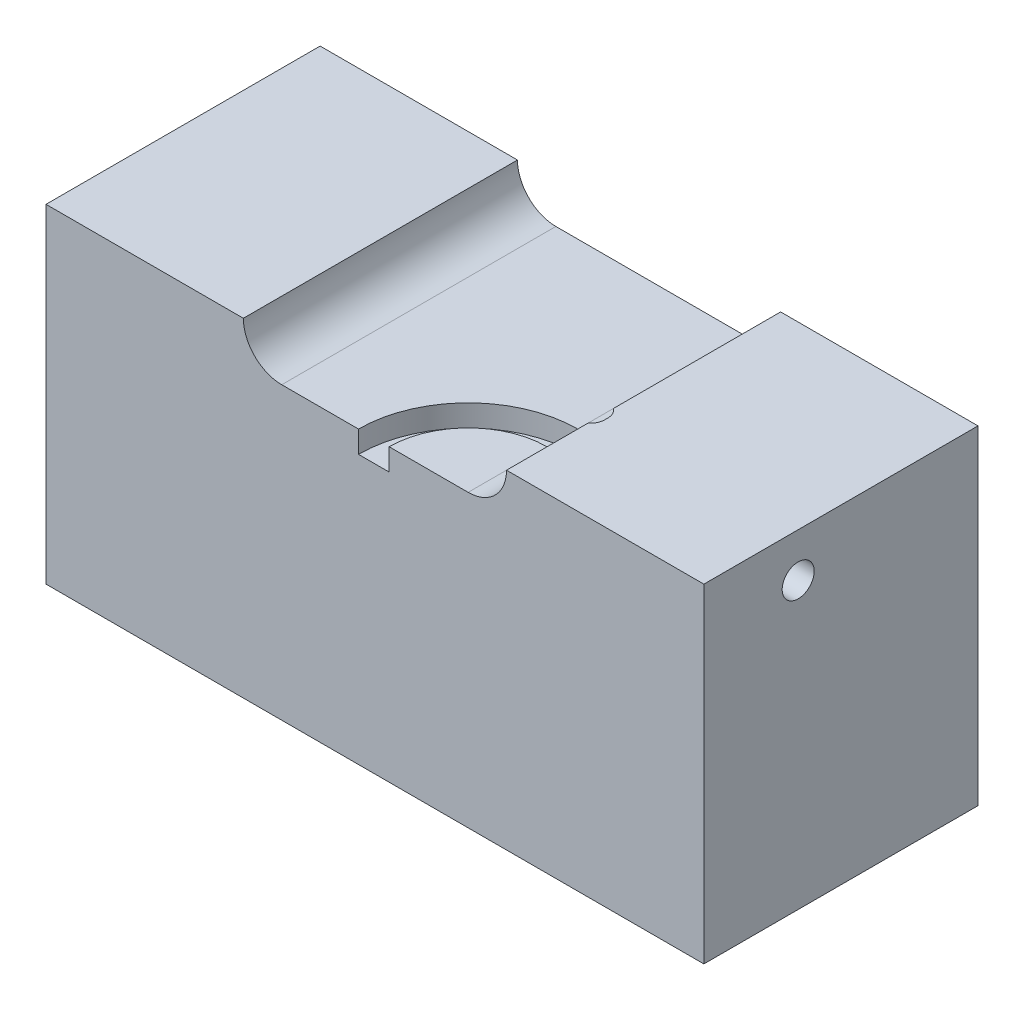
ISO-10303-21;
HEADER;
FILE_DESCRIPTION(('STEP AP214'),'2;1');
FILE_NAME('part.step','',(''),(''),'','','');
FILE_SCHEMA(('AUTOMOTIVE_DESIGN { 1 0 10303 214 1 1 1 1 }'));
ENDSEC;
DATA;
#1=APPLICATION_CONTEXT('core data for automotive mechanical design processes');
#2=APPLICATION_PROTOCOL_DEFINITION('international standard','automotive_design',2000,#1);
#3=PRODUCT_CONTEXT('',#1,'mechanical');
#4=PRODUCT('Part','Part','',(#3));
#5=PRODUCT_RELATED_PRODUCT_CATEGORY('part','',(#4));
#6=PRODUCT_DEFINITION_FORMATION('','',#4);
#7=PRODUCT_DEFINITION_CONTEXT('part definition',#1,'design');
#8=PRODUCT_DEFINITION('design','',#6,#7);
#9=PRODUCT_DEFINITION_SHAPE('','',#8);
#10=(LENGTH_UNIT() NAMED_UNIT(*) SI_UNIT(.MILLI.,.METRE.));
#11=(NAMED_UNIT(*) PLANE_ANGLE_UNIT() SI_UNIT($,.RADIAN.));
#12=(NAMED_UNIT(*) SI_UNIT($,.STERADIAN.) SOLID_ANGLE_UNIT());
#13=UNCERTAINTY_MEASURE_WITH_UNIT(LENGTH_MEASURE(1.E-05),#10,'distance_accuracy_value','');
#14=(GEOMETRIC_REPRESENTATION_CONTEXT(3) GLOBAL_UNCERTAINTY_ASSIGNED_CONTEXT((#13)) GLOBAL_UNIT_ASSIGNED_CONTEXT((#10,
#11,#12)) REPRESENTATION_CONTEXT('',''));
#15=CARTESIAN_POINT('',(0.,0.,0.));
#16=DIRECTION('',(0.,0.,1.));
#17=DIRECTION('',(1.,0.,0.));
#18=AXIS2_PLACEMENT_3D('',#15,#16,#17);
#19=CARTESIAN_POINT('',(7.14375000000001,15.5575,2.57175));
#20=DIRECTION('',(0.,1.,0.));
#21=DIRECTION('',(-1.,0.,0.));
#22=AXIS2_PLACEMENT_3D('',#19,#20,#21);
#23=CYLINDRICAL_SURFACE('',#22,0.79375);
#24=DIRECTION('',(0.,1.,0.));
#25=VECTOR('',#24,1.);
#26=CARTESIAN_POINT('',(7.93750000000001,15.5575,2.57174999999999));
#27=LINE('',#26,#25);
#28=CARTESIAN_POINT('',(7.93750000000001,17.432194040048,2.57174999999999));
#29=VERTEX_POINT('',#28);
#30=CARTESIAN_POINT('',(7.93750000000001,19.05,2.57174999999999));
#31=VERTEX_POINT('',#30);
#32=EDGE_CURVE('E267',#29,#31,#27,.T.);
#33=ORIENTED_EDGE('',*,*,#32,.F.);
#34=CARTESIAN_POINT('',(7.93750000000001,17.432194040048,2.57174999999999));
#35=CARTESIAN_POINT('',(7.93750241256333,17.4301936525798,2.59114478348494));
#36=CARTESIAN_POINT('',(7.93678870871886,17.4275767551003,2.6104621743929));
#37=CARTESIAN_POINT('',(7.93398641219167,17.4211587801819,2.64877953405351));
#38=CARTESIAN_POINT('',(7.93189915885153,17.4173588582055,2.66777979355258));
#39=CARTESIAN_POINT('',(7.92371352293546,17.4043339271178,2.72375715508424));
#40=CARTESIAN_POINT('',(7.91568889593078,17.3934433707352,2.76008855282001));
#41=CARTESIAN_POINT('',(7.895237760106,17.3679176659708,2.82987248338225));
#42=CARTESIAN_POINT('',(7.88282703010999,17.3532959918654,2.8633348082929));
#43=CARTESIAN_POINT('',(7.85435108605227,17.3209943364583,2.9271502135495));
#44=CARTESIAN_POINT('',(7.83827706911014,17.3033070133269,2.95749554469169));
#45=CARTESIAN_POINT('',(7.7950458041358,17.2568268517615,3.02812150391445));
#46=CARTESIAN_POINT('',(7.76620526596445,17.2266872046281,3.06648526942747));
#47=CARTESIAN_POINT('',(7.70386176114061,17.1631883580013,3.13611411534587));
#48=CARTESIAN_POINT('',(7.67034850885852,17.1298221071251,3.16736312385349));
#49=CARTESIAN_POINT('',(7.59865541927083,17.0604677895308,3.22385803437785));
#50=CARTESIAN_POINT('',(7.56037261542773,17.0244328617208,3.24891527401671));
#51=CARTESIAN_POINT('',(7.50013032175958,16.9706006600362,3.28136164838984));
#52=CARTESIAN_POINT('',(7.47959277776844,16.9527037493227,3.29131618012628));
#53=CARTESIAN_POINT('',(7.43740812370543,16.9173727822183,3.30953925463318));
#54=CARTESIAN_POINT('',(7.41576180347949,16.899938409412,3.31780897725127));
#55=CARTESIAN_POINT('',(7.37545059999082,16.8695567149893,3.33116497950011));
#56=CARTESIAN_POINT('',(7.35704266951007,16.856403873353,3.33655739616009));
#57=CARTESIAN_POINT('',(7.31896103433903,16.8315037640402,3.34617004709823));
#58=CARTESIAN_POINT('',(7.29928734644973,16.819756477713,3.35039029693117));
#59=CARTESIAN_POINT('',(7.26442510912182,16.8021227309386,3.35640819331776));
#60=CARTESIAN_POINT('',(7.24966003728041,16.7955350172339,3.35855282231827));
#61=CARTESIAN_POINT('',(7.21928974650045,16.784519893377,3.36204332277608));
#62=CARTESIAN_POINT('',(7.2036895553853,16.7800808834197,3.36339349186303));
#63=CARTESIAN_POINT('',(7.18055609109639,16.7758076177804,3.36467942917183));
#64=CARTESIAN_POINT('',(7.17325894960945,16.7747822406778,3.36498501857166));
#65=CARTESIAN_POINT('',(7.15856018619977,16.7733972488647,3.36539622095228));
#66=CARTESIAN_POINT('',(7.15115822518164,16.7730409698786,3.36550083203409));
#67=CARTESIAN_POINT('',(7.14375,16.7730464027505,3.3655));
#68=B_SPLINE_CURVE_WITH_KNOTS('',3,(#34,#35,#36,#37,#38,#39,#40,#41,#42,#43,#44,#45,#46,#47,#48,
#49,#50,#51,#52,#53,#54,#55,#56,#57,#58,#59,#60,#61,#62,#63,#64,#65,#66,#67),.UNSPECIFIED.,.F.,
.F.,(4,2,2,2,2,2,2,2,2,2,2,2,2,2,2,2,4),(0.,0.0584453265147501,0.1168337475043,
0.232488737897985,0.347731829907221,0.463254826944108,0.632339979221343,0.801803378714477,
0.975925812136693,1.06288483108186,1.14978274295621,1.21949579483512,1.28920792157083,
1.33802178064912,1.38656909412918,1.40866379827517,1.43086836401875),.UNSPECIFIED.);
#69=CARTESIAN_POINT('',(7.14375,16.7730464027505,3.3655));
#70=VERTEX_POINT('',#69);
#71=EDGE_CURVE('E48',#29,#70,#68,.T.);
#72=ORIENTED_EDGE('',*,*,#71,.T.);
#73=DIRECTION('',(0.,1.,0.));
#74=VECTOR('',#73,1.);
#75=CARTESIAN_POINT('',(7.14375,15.5575,3.3655));
#76=LINE('',#75,#74);
#77=CARTESIAN_POINT('',(7.14375,17.6751846714922,3.3655));
#78=VERTEX_POINT('',#77);
#79=EDGE_CURVE('E262',#70,#78,#76,.T.);
#80=ORIENTED_EDGE('',*,*,#79,.T.);
#81=CARTESIAN_POINT('',(7.62000000000001,19.05,3.20675));
#82=CARTESIAN_POINT('',(7.62000808222505,18.9976620086764,3.20669678540611));
#83=CARTESIAN_POINT('',(7.61815174304965,18.9453473715379,3.20813629686458));
#84=CARTESIAN_POINT('',(7.61078125391763,18.8411829924741,3.21358908145641));
#85=CARTESIAN_POINT('',(7.60527233116839,18.7893326933517,3.21759867627471));
#86=CARTESIAN_POINT('',(7.59066211493761,18.6863268479517,3.22778576557001));
#87=CARTESIAN_POINT('',(7.58155825030525,18.6351718260926,3.23396481131604));
#88=CARTESIAN_POINT('',(7.5598465844707,18.5338125931217,3.24781870998652));
#89=CARTESIAN_POINT('',(7.5472375453096,18.4836087246421,3.25549409110067));
#90=CARTESIAN_POINT('',(7.50289921844771,18.3299016765049,3.28043820747756));
#91=CARTESIAN_POINT('',(7.46535418005992,18.2282472369929,3.2990066799425));
#92=CARTESIAN_POINT('',(7.37568261057651,18.0312061917664,3.33236202096677));
#93=CARTESIAN_POINT('',(7.32360883953245,17.9357984212855,3.34716220863326));
#94=CARTESIAN_POINT('',(7.2458227786617,17.8153311257624,3.3591368661238));
#95=CARTESIAN_POINT('',(7.22636452973084,17.7866863514485,3.36144747485569));
#96=CARTESIAN_POINT('',(7.18607326983955,17.7302594935604,3.36462852535922));
#97=CARTESIAN_POINT('',(7.16523897881772,17.7024782496364,3.36549760595795));
#98=CARTESIAN_POINT('',(7.14375,17.6751846714922,3.3655));
#99=B_SPLINE_CURVE_WITH_KNOTS('',3,(#81,#82,#83,#84,#85,#86,#87,#88,#89,#90,#91,#92,#93,#94,#95,
#96,#97,#98),.UNSPECIFIED.,.F.,.F.,(4,2,2,2,2,2,2,2,4),(0.,0.156923704265635,0.313623318561804,
0.470435210112985,0.627302555066313,0.955983364493304,1.28348578985539,1.3875449931461,
1.49170239923897),.UNSPECIFIED.);
#100=CARTESIAN_POINT('',(7.62000000000001,19.05,3.20675));
#101=VERTEX_POINT('',#100);
#102=EDGE_CURVE('E450',#101,#78,#99,.T.);
#103=ORIENTED_EDGE('',*,*,#102,.F.);
#104=CARTESIAN_POINT('',(7.14375000000001,19.05,2.57175));
#105=DIRECTION('',(0.,1.,0.));
#106=DIRECTION('',(1.,0.,0.));
#107=AXIS2_PLACEMENT_3D('',#104,#105,#106);
#108=CIRCLE('',#107,0.79375);
#109=EDGE_CURVE('E269',#101,#31,#108,.T.);
#110=ORIENTED_EDGE('',*,*,#109,.T.);
#111=EDGE_LOOP('',(#33,#72,#80,#103,#110));
#112=FACE_BOUND('',#111,.T.);
#113=ADVANCED_FACE('F33',(#112),#23,.F.);
#114=CARTESIAN_POINT('',(7.14375000000001,15.5575,2.38125));
#115=DIRECTION('',(0.,1.,0.));
#116=DIRECTION('',(-1.,0.,0.));
#117=AXIS2_PLACEMENT_3D('',#114,#115,#116);
#118=CYLINDRICAL_SURFACE('',#117,0.79375);
#119=DIRECTION('',(0.,1.,0.));
#120=VECTOR('',#119,1.);
#121=CARTESIAN_POINT('',(7.14375,15.5575,1.5875));
#122=LINE('',#121,#120);
#123=CARTESIAN_POINT('',(7.14375,16.7730464027505,1.5875));
#124=VERTEX_POINT('',#123);
#125=CARTESIAN_POINT('',(7.14375,17.6751846714922,1.5875));
#126=VERTEX_POINT('',#125);
#127=EDGE_CURVE('E413',#124,#126,#122,.T.);
#128=ORIENTED_EDGE('',*,*,#127,.F.);
#129=CARTESIAN_POINT('',(7.14375,16.7730464027505,1.5875));
#130=CARTESIAN_POINT('',(7.15893791785662,16.7729781622669,1.58748921704763));
#131=CARTESIAN_POINT('',(7.17400569118337,16.774520458918,1.58793488840093));
#132=CARTESIAN_POINT('',(7.2033431203434,16.7800966910772,1.58960967974904));
#133=CARTESIAN_POINT('',(7.2176225803887,16.7840818079715,1.59082346437744));
#134=CARTESIAN_POINT('',(7.25380469471549,16.79680827117,1.59484356499905));
#135=CARTESIAN_POINT('',(7.27512209176527,16.8069686475094,1.59816869743157));
#136=CARTESIAN_POINT('',(7.31633968048021,16.8297623078841,1.60620308347879));
#137=CARTESIAN_POINT('',(7.33621959877839,16.8424240312471,1.61092860089324));
#138=CARTESIAN_POINT('',(7.3778704294022,16.8711125710446,1.62245813516733));
#139=CARTESIAN_POINT('',(7.39943301006975,16.8873533586215,1.62947398619911));
#140=CARTESIAN_POINT('',(7.44138305141542,16.920593693588,1.64507521373498));
#141=CARTESIAN_POINT('',(7.46176933083153,16.9375939742988,1.65366213305371));
#142=CARTESIAN_POINT('',(7.5214319364034,16.9889203174978,1.68172805605678));
#143=CARTESIAN_POINT('',(7.55930056775818,17.0236393239732,1.70353759601027));
#144=CARTESIAN_POINT('',(7.63841851328629,17.098430775985,1.75829927874638));
#145=CARTESIAN_POINT('',(7.67896795887995,17.1382846809269,1.79257458129802));
#146=CARTESIAN_POINT('',(7.75403094099641,17.2140168410449,1.87084007747242));
#147=CARTESIAN_POINT('',(7.78855810799545,17.2499040050053,1.91480780899977));
#148=CARTESIAN_POINT('',(7.83769152755564,17.302647647905,1.994244816951));
#149=CARTESIAN_POINT('',(7.85491185054322,17.3215928274382,2.02671440914579));
#150=CARTESIAN_POINT('',(7.88511096397851,17.3559280219605,2.0952126040897));
#151=CARTESIAN_POINT('',(7.89810333803431,17.371329374934,2.13122931488013));
#152=CARTESIAN_POINT('',(7.91781786866114,17.3962994434745,2.2021977765273));
#153=CARTESIAN_POINT('',(7.92506881061527,17.4063207127409,2.2368382969144));
#154=CARTESIAN_POINT('',(7.93245517265907,17.418352232104,2.29009390820122));
#155=CARTESIAN_POINT('',(7.93433608261143,17.4218715687023,2.30814513676567));
#156=CARTESIAN_POINT('',(7.93686009185863,17.4278440916586,2.3445246385013));
#157=CARTESIAN_POINT('',(7.93750208529729,17.4302963240094,2.36285314447942));
#158=CARTESIAN_POINT('',(7.93750000000001,17.432194040048,2.38125));
#159=B_SPLINE_CURVE_WITH_KNOTS('',3,(#129,#130,#131,#132,#133,#134,#135,#136,#137,#138,#139,
#140,#141,#142,#143,#144,#145,#146,#147,#148,#149,#150,#151,#152,#153,#154,#155,#156,#157,#158),
.UNSPECIFIED.,.F.,.F.,(4,2,2,2,2,2,2,2,2,2,2,2,2,2,4),(0.,0.0452895664750722,0.0897022840237409,
0.16084907513867,0.232856893385674,0.316417547963784,0.400060705247937,0.56700730952557,
0.765293828106022,0.963125562501087,1.08674096362214,1.20995519788227,1.31975004138661,
1.37514445888962,1.43058829859038),.UNSPECIFIED.);
#160=CARTESIAN_POINT('',(7.93750000000001,17.432194040048,2.38125));
#161=VERTEX_POINT('',#160);
#162=EDGE_CURVE('E194',#124,#161,#159,.T.);
#163=ORIENTED_EDGE('',*,*,#162,.T.);
#164=DIRECTION('',(0.,1.,0.));
#165=VECTOR('',#164,1.);
#166=CARTESIAN_POINT('',(7.93750000000001,15.5575,2.38125));
#167=LINE('',#166,#165);
#168=CARTESIAN_POINT('',(7.93750000000001,19.05,2.38125));
#169=VERTEX_POINT('',#168);
#170=EDGE_CURVE('E277',#161,#169,#167,.T.);
#171=ORIENTED_EDGE('',*,*,#170,.T.);
#172=CARTESIAN_POINT('',(7.14375000000001,19.05,2.38125));
#173=DIRECTION('',(0.,1.,0.));
#174=DIRECTION('',(-1.,0.,0.));
#175=AXIS2_PLACEMENT_3D('',#172,#173,#174);
#176=CIRCLE('',#175,0.79375);
#177=CARTESIAN_POINT('',(7.62000000000001,19.05,1.74625));
#178=VERTEX_POINT('',#177);
#179=EDGE_CURVE('E56',#169,#178,#176,.T.);
#180=ORIENTED_EDGE('',*,*,#179,.T.);
#181=CARTESIAN_POINT('',(7.14375,17.6751846714922,1.5875));
#182=CARTESIAN_POINT('',(7.17493882903404,17.7147904593139,1.58751596606703));
#183=CARTESIAN_POINT('',(7.20473558813774,17.7554189700609,1.58933610151038));
#184=CARTESIAN_POINT('',(7.26136996565832,17.8383868944045,1.59574312729626));
#185=CARTESIAN_POINT('',(7.28821258149453,17.8807232477425,1.60032525746599));
#186=CARTESIAN_POINT('',(7.3389098633342,17.966975133551,1.61142884391584));
#187=CARTESIAN_POINT('',(7.36275997006245,18.0108929475555,1.61795320951428));
#188=CARTESIAN_POINT('',(7.40738778736858,18.1000808312739,1.63219518026388));
#189=CARTESIAN_POINT('',(7.4281640525646,18.1453515251891,1.63991334329549));
#190=CARTESIAN_POINT('',(7.48841301880205,18.2891746871459,1.66485679832621));
#191=CARTESIAN_POINT('',(7.52239504808017,18.3899758849743,1.68294497040577));
#192=CARTESIAN_POINT('',(7.56234987491672,18.54428448952,1.70667488917068));
#193=CARTESIAN_POINT('',(7.57382524483121,18.5961801786834,1.71401164819873));
#194=CARTESIAN_POINT('',(7.59305267803054,18.7008824439455,1.7268035479083));
#195=CARTESIAN_POINT('',(7.6008067955423,18.7536885007802,1.73225972624879));
#196=CARTESIAN_POINT('',(7.61108668898027,18.8470681393693,1.73963762139058));
#197=CARTESIAN_POINT('',(7.6144233283184,18.8875119988091,1.74209497073602));
#198=CARTESIAN_POINT('',(7.61888265518496,18.9686335235272,1.74541197906694));
#199=CARTESIAN_POINT('',(7.62000273710662,19.009311407665,1.74626975765739));
#200=CARTESIAN_POINT('',(7.62000000000001,19.05,1.74625));
#201=B_SPLINE_CURVE_WITH_KNOTS('',3,(#181,#182,#183,#184,#185,#186,#187,#188,#189,#190,#191,
#192,#193,#194,#195,#196,#197,#198,#199,#200),.UNSPECIFIED.,.F.,.F.,(4,2,2,2,2,2,2,2,2,4),(0.,
0.151091968467232,0.301924278346454,0.452983670059177,0.604113868697295,0.926493060198701,
1.08733203777102,1.24808212567329,1.36996150858661,1.49198407820246),.UNSPECIFIED.);
#202=EDGE_CURVE('E351',#126,#178,#201,.T.);
#203=ORIENTED_EDGE('',*,*,#202,.F.);
#204=EDGE_LOOP('',(#128,#163,#171,#180,#203));
#205=FACE_BOUND('',#204,.T.);
#206=ADVANCED_FACE('F368',(#205),#118,.F.);
#207=CARTESIAN_POINT('',(7.93750000000001,15.5575,2.57174999999999));
#208=DIRECTION('',(1.,0.,0.));
#209=DIRECTION('',(0.,1.,0.));
#210=AXIS2_PLACEMENT_3D('',#207,#208,#209);
#211=PLANE('',#210);
#212=CARTESIAN_POINT('',(7.93750000000001,15.5575,2.57174999999999));
#213=VERTEX_POINT('',#212);
#214=CARTESIAN_POINT('',(7.93750000000001,15.587805959952,2.57174999999999));
#215=VERTEX_POINT('',#214);
#216=EDGE_CURVE('E273',#213,#215,#27,.T.);
#217=ORIENTED_EDGE('',*,*,#216,.T.);
#218=CARTESIAN_POINT('',(7.93750000000001,16.51,2.4765));
#219=DIRECTION('',(1.,0.,0.));
#220=DIRECTION('',(0.,1.,0.));
#221=AXIS2_PLACEMENT_3D('',#218,#219,#220);
#222=CIRCLE('',#221,0.9271);
#223=CARTESIAN_POINT('',(7.93750000000001,15.587805959952,2.38125));
#224=VERTEX_POINT('',#223);
#225=EDGE_CURVE('E41',#215,#224,#222,.T.);
#226=ORIENTED_EDGE('',*,*,#225,.T.);
#227=CARTESIAN_POINT('',(7.93750000000001,15.5575,2.38125));
#228=VERTEX_POINT('',#227);
#229=EDGE_CURVE('E283',#228,#224,#167,.T.);
#230=ORIENTED_EDGE('',*,*,#229,.F.);
#231=DIRECTION('',(0.,0.,-1.));
#232=VECTOR('',#231,1.);
#233=CARTESIAN_POINT('',(7.93750000000001,15.5575,2.57174999999999));
#234=LINE('',#233,#232);
#235=EDGE_CURVE('E421',#213,#228,#234,.T.);
#236=ORIENTED_EDGE('',*,*,#235,.F.);
#237=EDGE_LOOP('',(#217,#226,#230,#236));
#238=FACE_BOUND('',#237,.T.);
#239=ADVANCED_FACE('F373',(#238),#211,.F.);
#240=CARTESIAN_POINT('',(-5.3975,16.8275,17.4625));
#241=DIRECTION('',(0.,-1.,0.));
#242=DIRECTION('',(1.,0.,0.));
#243=AXIS2_PLACEMENT_3D('',#240,#241,#242);
#244=PLANE('',#243);
#245=DIRECTION('',(0.,0.,-1.));
#246=VECTOR('',#245,1.);
#247=CARTESIAN_POINT('',(5.3975,16.8275,17.4625));
#248=LINE('',#247,#246);
#249=CARTESIAN_POINT('',(5.3975,16.8275,7.9375));
#250=VERTEX_POINT('',#249);
#251=CARTESIAN_POINT('',(5.39750000000001,16.8275,3.3655));
#252=VERTEX_POINT('',#251);
#253=EDGE_CURVE('E298',#250,#252,#248,.T.);
#254=ORIENTED_EDGE('',*,*,#253,.T.);
#255=CARTESIAN_POINT('',(5.3975,16.8275,7.9375));
#256=DIRECTION('',(0.,-1.,0.));
#257=DIRECTION('',(1.,0.,0.));
#258=AXIS2_PLACEMENT_3D('',#255,#256,#257);
#259=CIRCLE('',#258,4.572);
#260=CARTESIAN_POINT('',(0.825500000000005,16.8275,7.9375));
#261=VERTEX_POINT('',#260);
#262=EDGE_CURVE('E453',#252,#261,#259,.F.);
#263=ORIENTED_EDGE('',*,*,#262,.T.);
#264=DIRECTION('',(-1.,0.,0.));
#265=VECTOR('',#264,1.);
#266=CARTESIAN_POINT('',(-19.05,16.8275,7.9375));
#267=LINE('',#266,#265);
#268=EDGE_CURVE('E348',#250,#261,#267,.T.);
#269=ORIENTED_EDGE('',*,*,#268,.F.);
#270=EDGE_LOOP('',(#254,#263,#269));
#271=FACE_BOUND('',#270,.T.);
#272=ADVANCED_FACE('F380',(#271),#244,.F.);
#273=CARTESIAN_POINT('',(5.3975,19.05,17.4625));
#274=DIRECTION('',(0.,0.,-1.));
#275=DIRECTION('',(-1.,0.,0.));
#276=AXIS2_PLACEMENT_3D('',#273,#274,#275);
#277=CYLINDRICAL_SURFACE('',#276,2.2225);
#278=DIRECTION('',(0.,0.,-1.));
#279=VECTOR('',#278,1.);
#280=CARTESIAN_POINT('',(7.62000000000001,19.05,17.4625));
#281=LINE('',#280,#279);
#282=CARTESIAN_POINT('',(7.62,19.05,7.9375));
#283=VERTEX_POINT('',#282);
#284=EDGE_CURVE('E340',#101,#283,#281,.F.);
#285=ORIENTED_EDGE('',*,*,#284,.F.);
#286=ORIENTED_EDGE('',*,*,#102,.T.);
#287=CARTESIAN_POINT('',(5.3975,19.05,3.3655));
#288=DIRECTION('',(0.,0.,1.));
#289=DIRECTION('',(1.,0.,0.));
#290=AXIS2_PLACEMENT_3D('',#287,#288,#289);
#291=CIRCLE('',#290,2.2225);
#292=EDGE_CURVE('E443',#78,#252,#291,.F.);
#293=ORIENTED_EDGE('',*,*,#292,.T.);
#294=ORIENTED_EDGE('',*,*,#253,.F.);
#295=CARTESIAN_POINT('',(5.3975,19.05,7.9375));
#296=DIRECTION('',(0.,0.,-1.));
#297=DIRECTION('',(-1.,0.,0.));
#298=AXIS2_PLACEMENT_3D('',#295,#296,#297);
#299=CIRCLE('',#298,2.2225);
#300=EDGE_CURVE('E297',#283,#250,#299,.T.);
#301=ORIENTED_EDGE('',*,*,#300,.F.);
#302=EDGE_LOOP('',(#285,#286,#293,#294,#301));
#303=FACE_BOUND('',#302,.T.);
#304=ADVANCED_FACE('F448',(#303),#277,.F.);
#305=CARTESIAN_POINT('',(0.,19.05,0.));
#306=DIRECTION('',(0.,-1.,0.));
#307=DIRECTION('',(0.,0.,-1.));
#308=AXIS2_PLACEMENT_3D('',#305,#306,#307);
#309=PLANE('',#308);
#310=DIRECTION('',(1.,0.,0.));
#311=VECTOR('',#310,1.);
#312=CARTESIAN_POINT('',(-19.05,19.05,7.9375));
#313=LINE('',#312,#311);
#314=CARTESIAN_POINT('',(-19.05,19.05,7.9375));
#315=VERTEX_POINT('',#314);
#316=CARTESIAN_POINT('',(-7.61999999999999,19.05,7.9375));
#317=VERTEX_POINT('',#316);
#318=EDGE_CURVE('E318',#315,#317,#313,.T.);
#319=ORIENTED_EDGE('',*,*,#318,.T.);
#320=DIRECTION('',(0.,0.,-1.));
#321=VECTOR('',#320,1.);
#322=CARTESIAN_POINT('',(-7.61999999999999,19.05,17.4625));
#323=LINE('',#322,#321);
#324=CARTESIAN_POINT('',(-7.61999999999999,19.05,-7.9375));
#325=VERTEX_POINT('',#324);
#326=EDGE_CURVE('E344',#317,#325,#323,.T.);
#327=ORIENTED_EDGE('',*,*,#326,.T.);
#328=DIRECTION('',(-1.,0.,0.));
#329=VECTOR('',#328,1.);
#330=CARTESIAN_POINT('',(-19.05,19.05,-7.9375));
#331=LINE('',#330,#329);
#332=CARTESIAN_POINT('',(-19.05,19.05,-7.9375));
#333=VERTEX_POINT('',#332);
#334=EDGE_CURVE('E310',#325,#333,#331,.T.);
#335=ORIENTED_EDGE('',*,*,#334,.T.);
#336=DIRECTION('',(0.,0.,1.));
#337=VECTOR('',#336,1.);
#338=CARTESIAN_POINT('',(-19.05,19.05,7.9375));
#339=LINE('',#338,#337);
#340=EDGE_CURVE('E315',#333,#315,#339,.T.);
#341=ORIENTED_EDGE('',*,*,#340,.T.);
#342=EDGE_LOOP('',(#319,#327,#335,#341));
#343=FACE_BOUND('',#342,.T.);
#344=ADVANCED_FACE('F465',(#343),#309,.F.);
#345=CARTESIAN_POINT('',(19.05,19.05,7.9375));
#346=DIRECTION('',(-1.,0.,0.));
#347=DIRECTION('',(0.,0.,1.));
#348=AXIS2_PLACEMENT_3D('',#345,#346,#347);
#349=PLANE('',#348);
#350=CARTESIAN_POINT('',(19.05,16.51,2.4765));
#351=DIRECTION('',(1.,0.,0.));
#352=DIRECTION('',(0.,0.,-1.));
#353=AXIS2_PLACEMENT_3D('',#350,#351,#352);
#354=CIRCLE('',#353,0.9271);
#355=CARTESIAN_POINT('',(19.05,16.51,1.5494));
#356=VERTEX_POINT('',#355);
#357=EDGE_CURVE('E202',#356,#356,#354,.T.);
#358=ORIENTED_EDGE('',*,*,#357,.F.);
#359=EDGE_LOOP('',(#358));
#360=FACE_BOUND('',#359,.T.);
#361=DIRECTION('',(0.,0.,-1.));
#362=VECTOR('',#361,1.);
#363=CARTESIAN_POINT('',(19.05,0.,7.9375));
#364=LINE('',#363,#362);
#365=CARTESIAN_POINT('',(19.05,0.,7.9375));
#366=VERTEX_POINT('',#365);
#367=CARTESIAN_POINT('',(19.05,0.,-7.9375));
#368=VERTEX_POINT('',#367);
#369=EDGE_CURVE('E306',#366,#368,#364,.T.);
#370=ORIENTED_EDGE('',*,*,#369,.T.);
#371=DIRECTION('',(0.,-1.,0.));
#372=VECTOR('',#371,1.);
#373=CARTESIAN_POINT('',(19.05,19.05,-7.9375));
#374=LINE('',#373,#372);
#375=CARTESIAN_POINT('',(19.05,19.05,-7.9375));
#376=VERTEX_POINT('',#375);
#377=EDGE_CURVE('E337',#376,#368,#374,.T.);
#378=ORIENTED_EDGE('',*,*,#377,.F.);
#379=DIRECTION('',(0.,0.,-1.));
#380=VECTOR('',#379,1.);
#381=CARTESIAN_POINT('',(19.05,19.05,7.9375));
#382=LINE('',#381,#380);
#383=CARTESIAN_POINT('',(19.05,19.05,7.9375));
#384=VERTEX_POINT('',#383);
#385=EDGE_CURVE('E307',#384,#376,#382,.T.);
#386=ORIENTED_EDGE('',*,*,#385,.F.);
#387=DIRECTION('',(0.,-1.,0.));
#388=VECTOR('',#387,1.);
#389=CARTESIAN_POINT('',(19.05,19.05,7.9375));
#390=LINE('',#389,#388);
#391=EDGE_CURVE('E321',#384,#366,#390,.T.);
#392=ORIENTED_EDGE('',*,*,#391,.T.);
#393=EDGE_LOOP('',(#370,#378,#386,#392));
#394=FACE_BOUND('',#393,.T.);
#395=ADVANCED_FACE('F35',(#360,#394),#349,.F.);
#396=CARTESIAN_POINT('',(-19.05,19.05,-7.9375));
#397=DIRECTION('',(0.,0.,1.));
#398=DIRECTION('',(1.,0.,0.));
#399=AXIS2_PLACEMENT_3D('',#396,#397,#398);
#400=PLANE('',#399);
#401=ORIENTED_EDGE('',*,*,#334,.F.);
#402=CARTESIAN_POINT('',(-5.39749999999999,19.05,-7.9375));
#403=DIRECTION('',(0.,0.,-1.));
#404=DIRECTION('',(-1.,0.,0.));
#405=AXIS2_PLACEMENT_3D('',#402,#403,#404);
#406=CIRCLE('',#405,2.2225);
#407=CARTESIAN_POINT('',(-5.3975,16.8275,-7.9375));
#408=VERTEX_POINT('',#407);
#409=EDGE_CURVE('E285',#408,#325,#406,.T.);
#410=ORIENTED_EDGE('',*,*,#409,.F.);
#411=DIRECTION('',(-1.,0.,0.));
#412=VECTOR('',#411,1.);
#413=CARTESIAN_POINT('',(-5.3975,16.8275,-7.9375));
#414=LINE('',#413,#412);
#415=CARTESIAN_POINT('',(5.3975,16.8275,-7.9375));
#416=VERTEX_POINT('',#415);
#417=EDGE_CURVE('E291',#416,#408,#414,.T.);
#418=ORIENTED_EDGE('',*,*,#417,.F.);
#419=CARTESIAN_POINT('',(5.3975,19.05,-7.9375));
#420=DIRECTION('',(0.,0.,-1.));
#421=DIRECTION('',(-1.,0.,0.));
#422=AXIS2_PLACEMENT_3D('',#419,#420,#421);
#423=CIRCLE('',#422,2.2225);
#424=CARTESIAN_POINT('',(7.62000000000001,19.05,-7.9375));
#425=VERTEX_POINT('',#424);
#426=EDGE_CURVE('E287',#425,#416,#423,.T.);
#427=ORIENTED_EDGE('',*,*,#426,.F.);
#428=EDGE_CURVE('E312',#376,#425,#331,.T.);
#429=ORIENTED_EDGE('',*,*,#428,.F.);
#430=ORIENTED_EDGE('',*,*,#377,.T.);
#431=DIRECTION('',(-1.,0.,0.));
#432=VECTOR('',#431,1.);
#433=CARTESIAN_POINT('',(-19.05,0.,-7.9375));
#434=LINE('',#433,#432);
#435=CARTESIAN_POINT('',(-19.05,0.,-7.9375));
#436=VERTEX_POINT('',#435);
#437=EDGE_CURVE('E324',#368,#436,#434,.T.);
#438=ORIENTED_EDGE('',*,*,#437,.T.);
#439=DIRECTION('',(0.,-1.,0.));
#440=VECTOR('',#439,1.);
#441=CARTESIAN_POINT('',(-19.05,19.05,-7.9375));
#442=LINE('',#441,#440);
#443=EDGE_CURVE('E334',#333,#436,#442,.T.);
#444=ORIENTED_EDGE('',*,*,#443,.F.);
#445=EDGE_LOOP('',(#401,#410,#418,#427,#429,#430,#438,#444));
#446=FACE_BOUND('',#445,.T.);
#447=ADVANCED_FACE('F464',(#446),#400,.F.);
#448=CARTESIAN_POINT('',(-19.05,19.05,7.9375));
#449=DIRECTION('',(1.,0.,0.));
#450=DIRECTION('',(0.,0.,-1.));
#451=AXIS2_PLACEMENT_3D('',#448,#449,#450);
#452=PLANE('',#451);
#453=DIRECTION('',(0.,0.,1.));
#454=VECTOR('',#453,1.);
#455=CARTESIAN_POINT('',(-19.05,0.,7.9375));
#456=LINE('',#455,#454);
#457=CARTESIAN_POINT('',(-19.05,0.,7.9375));
#458=VERTEX_POINT('',#457);
#459=EDGE_CURVE('E326',#436,#458,#456,.T.);
#460=ORIENTED_EDGE('',*,*,#459,.T.);
#461=DIRECTION('',(0.,-1.,0.));
#462=VECTOR('',#461,1.);
#463=CARTESIAN_POINT('',(-19.05,19.05,7.9375));
#464=LINE('',#463,#462);
#465=EDGE_CURVE('E331',#315,#458,#464,.T.);
#466=ORIENTED_EDGE('',*,*,#465,.F.);
#467=ORIENTED_EDGE('',*,*,#340,.F.);
#468=ORIENTED_EDGE('',*,*,#443,.T.);
#469=EDGE_LOOP('',(#460,#466,#467,#468));
#470=FACE_BOUND('',#469,.T.);
#471=ADVANCED_FACE('F506',(#470),#452,.F.);
#472=CARTESIAN_POINT('',(-19.05,19.05,7.9375));
#473=DIRECTION('',(0.,0.,-1.));
#474=DIRECTION('',(-1.,0.,0.));
#475=AXIS2_PLACEMENT_3D('',#472,#473,#474);
#476=PLANE('',#475);
#477=ORIENTED_EDGE('',*,*,#268,.T.);
#478=DIRECTION('',(0.,1.,0.));
#479=VECTOR('',#478,1.);
#480=CARTESIAN_POINT('',(0.825500000000005,15.5575,7.9375));
#481=LINE('',#480,#479);
#482=CARTESIAN_POINT('',(0.825500000000005,15.5575,7.9375));
#483=VERTEX_POINT('',#482);
#484=EDGE_CURVE('E406',#483,#261,#481,.T.);
#485=ORIENTED_EDGE('',*,*,#484,.F.);
#486=DIRECTION('',(1.,0.,0.));
#487=VECTOR('',#486,1.);
#488=CARTESIAN_POINT('',(0.825500000000005,15.5575,7.9375));
#489=LINE('',#488,#487);
#490=CARTESIAN_POINT('',(-0.952499999999995,15.5575,7.9375));
#491=VERTEX_POINT('',#490);
#492=EDGE_CURVE('E436',#491,#483,#489,.T.);
#493=ORIENTED_EDGE('',*,*,#492,.F.);
#494=DIRECTION('',(0.,1.,0.));
#495=VECTOR('',#494,1.);
#496=CARTESIAN_POINT('',(-0.952499999999995,15.5575,7.9375));
#497=LINE('',#496,#495);
#498=CARTESIAN_POINT('',(-0.952499999999995,16.8275,7.9375));
#499=VERTEX_POINT('',#498);
#500=EDGE_CURVE('E408',#491,#499,#497,.T.);
#501=ORIENTED_EDGE('',*,*,#500,.T.);
#502=CARTESIAN_POINT('',(-5.3975,16.8275,7.9375));
#503=VERTEX_POINT('',#502);
#504=EDGE_CURVE('E347',#499,#503,#267,.T.);
#505=ORIENTED_EDGE('',*,*,#504,.T.);
#506=CARTESIAN_POINT('',(-5.39749999999999,19.05,7.9375));
#507=DIRECTION('',(0.,0.,-1.));
#508=DIRECTION('',(-1.,0.,0.));
#509=AXIS2_PLACEMENT_3D('',#506,#507,#508);
#510=CIRCLE('',#509,2.2225);
#511=EDGE_CURVE('E303',#503,#317,#510,.T.);
#512=ORIENTED_EDGE('',*,*,#511,.T.);
#513=ORIENTED_EDGE('',*,*,#318,.F.);
#514=ORIENTED_EDGE('',*,*,#465,.T.);
#515=DIRECTION('',(1.,0.,0.));
#516=VECTOR('',#515,1.);
#517=CARTESIAN_POINT('',(-19.05,0.,7.9375));
#518=LINE('',#517,#516);
#519=EDGE_CURVE('E311',#458,#366,#518,.T.);
#520=ORIENTED_EDGE('',*,*,#519,.T.);
#521=ORIENTED_EDGE('',*,*,#391,.F.);
#522=EDGE_CURVE('E317',#283,#384,#313,.T.);
#523=ORIENTED_EDGE('',*,*,#522,.F.);
#524=ORIENTED_EDGE('',*,*,#300,.T.);
#525=EDGE_LOOP('',(#477,#485,#493,#501,#505,#512,#513,#514,#520,#521,#523,#524));
#526=FACE_BOUND('',#525,.T.);
#527=ADVANCED_FACE('F455',(#526),#476,.F.);
#528=DIRECTION('',(0.,0.,-1.));
#529=VECTOR('',#528,1.);
#530=CARTESIAN_POINT('',(7.93750000000001,19.05,2.57174999999999));
#531=LINE('',#530,#529);
#532=EDGE_CURVE('E416',#31,#169,#531,.T.);
#533=ORIENTED_EDGE('',*,*,#532,.F.);
#534=ORIENTED_EDGE('',*,*,#109,.F.);
#535=ORIENTED_EDGE('',*,*,#284,.T.);
#536=ORIENTED_EDGE('',*,*,#522,.T.);
#537=ORIENTED_EDGE('',*,*,#385,.T.);
#538=ORIENTED_EDGE('',*,*,#428,.T.);
#539=EDGE_CURVE('E341',#425,#178,#281,.F.);
#540=ORIENTED_EDGE('',*,*,#539,.T.);
#541=ORIENTED_EDGE('',*,*,#179,.F.);
#542=EDGE_LOOP('',(#533,#534,#535,#536,#537,#538,#540,#541));
#543=FACE_BOUND('',#542,.T.);
#544=ADVANCED_FACE('F419',(#543),#309,.F.);
#545=CARTESIAN_POINT('',(0.,0.,0.));
#546=DIRECTION('',(0.,-1.,0.));
#547=DIRECTION('',(0.,0.,-1.));
#548=AXIS2_PLACEMENT_3D('',#545,#546,#547);
#549=PLANE('',#548);
#550=ORIENTED_EDGE('',*,*,#369,.F.);
#551=ORIENTED_EDGE('',*,*,#519,.F.);
#552=ORIENTED_EDGE('',*,*,#459,.F.);
#553=ORIENTED_EDGE('',*,*,#437,.F.);
#554=EDGE_LOOP('',(#550,#551,#552,#553));
#555=FACE_BOUND('',#554,.T.);
#556=ADVANCED_FACE('F471',(#555),#549,.T.);
#557=ORIENTED_EDGE('',*,*,#504,.F.);
#558=CARTESIAN_POINT('',(5.3975,16.8275,7.9375));
#559=DIRECTION('',(0.,-1.,0.));
#560=DIRECTION('',(1.,0.,0.));
#561=AXIS2_PLACEMENT_3D('',#558,#559,#560);
#562=CIRCLE('',#561,6.35);
#563=CARTESIAN_POINT('',(5.3975,16.8275,1.5875));
#564=VERTEX_POINT('',#563);
#565=EDGE_CURVE('E484',#499,#564,#562,.T.);
#566=ORIENTED_EDGE('',*,*,#565,.T.);
#567=EDGE_CURVE('E294',#564,#416,#248,.T.);
#568=ORIENTED_EDGE('',*,*,#567,.T.);
#569=ORIENTED_EDGE('',*,*,#417,.T.);
#570=DIRECTION('',(0.,0.,-1.));
#571=VECTOR('',#570,1.);
#572=CARTESIAN_POINT('',(-5.3975,16.8275,17.4625));
#573=LINE('',#572,#571);
#574=EDGE_CURVE('E295',#503,#408,#573,.T.);
#575=ORIENTED_EDGE('',*,*,#574,.F.);
#576=EDGE_LOOP('',(#557,#566,#568,#569,#575));
#577=FACE_BOUND('',#576,.T.);
#578=ADVANCED_FACE('F487',(#577),#244,.F.);
#579=CARTESIAN_POINT('',(-5.39749999999999,19.05,17.4625));
#580=DIRECTION('',(0.,0.,-1.));
#581=DIRECTION('',(-1.,0.,0.));
#582=AXIS2_PLACEMENT_3D('',#579,#580,#581);
#583=CYLINDRICAL_SURFACE('',#582,2.2225);
#584=ORIENTED_EDGE('',*,*,#574,.T.);
#585=ORIENTED_EDGE('',*,*,#409,.T.);
#586=ORIENTED_EDGE('',*,*,#326,.F.);
#587=ORIENTED_EDGE('',*,*,#511,.F.);
#588=EDGE_LOOP('',(#584,#585,#586,#587));
#589=FACE_BOUND('',#588,.T.);
#590=ADVANCED_FACE('F501',(#589),#583,.F.);
#591=ORIENTED_EDGE('',*,*,#567,.F.);
#592=CARTESIAN_POINT('',(5.3975,19.05,1.5875));
#593=DIRECTION('',(0.,0.,-1.));
#594=DIRECTION('',(-1.,0.,0.));
#595=AXIS2_PLACEMENT_3D('',#592,#593,#594);
#596=CIRCLE('',#595,2.2225);
#597=EDGE_CURVE('E357',#564,#126,#596,.F.);
#598=ORIENTED_EDGE('',*,*,#597,.T.);
#599=ORIENTED_EDGE('',*,*,#202,.T.);
#600=ORIENTED_EDGE('',*,*,#539,.F.);
#601=ORIENTED_EDGE('',*,*,#426,.T.);
#602=EDGE_LOOP('',(#591,#598,#599,#600,#601));
#603=FACE_BOUND('',#602,.T.);
#604=ADVANCED_FACE('F359',(#603),#277,.F.);
#605=CARTESIAN_POINT('',(5.3975,15.5575,7.9375));
#606=DIRECTION('',(0.,1.,0.));
#607=DIRECTION('',(-1.,0.,0.));
#608=AXIS2_PLACEMENT_3D('',#605,#606,#607);
#609=CYLINDRICAL_SURFACE('',#608,4.572);
#610=DIRECTION('',(0.,1.,0.));
#611=VECTOR('',#610,1.);
#612=CARTESIAN_POINT('',(5.39750000000001,15.5575,3.3655));
#613=LINE('',#612,#611);
#614=CARTESIAN_POINT('',(5.39750000000001,15.5575,3.3655));
#615=VERTEX_POINT('',#614);
#616=EDGE_CURVE('E401',#615,#252,#613,.T.);
#617=ORIENTED_EDGE('',*,*,#616,.F.);
#618=CARTESIAN_POINT('',(5.3975,15.5575,7.9375));
#619=DIRECTION('',(0.,-1.,0.));
#620=DIRECTION('',(-1.,0.,0.));
#621=AXIS2_PLACEMENT_3D('',#618,#619,#620);
#622=CIRCLE('',#621,4.572);
#623=EDGE_CURVE('E279',#483,#615,#622,.T.);
#624=ORIENTED_EDGE('',*,*,#623,.F.);
#625=ORIENTED_EDGE('',*,*,#484,.T.);
#626=ORIENTED_EDGE('',*,*,#262,.F.);
#627=EDGE_LOOP('',(#617,#624,#625,#626));
#628=FACE_BOUND('',#627,.T.);
#629=ADVANCED_FACE('F393',(#628),#609,.T.);
#630=CARTESIAN_POINT('',(5.3975,15.5575,7.9375));
#631=DIRECTION('',(0.,1.,0.));
#632=DIRECTION('',(-1.,0.,0.));
#633=AXIS2_PLACEMENT_3D('',#630,#631,#632);
#634=CYLINDRICAL_SURFACE('',#633,6.35);
#635=ORIENTED_EDGE('',*,*,#500,.F.);
#636=CARTESIAN_POINT('',(5.3975,15.5575,7.9375));
#637=DIRECTION('',(0.,1.,0.));
#638=DIRECTION('',(-1.,0.,0.));
#639=AXIS2_PLACEMENT_3D('',#636,#637,#638);
#640=CIRCLE('',#639,6.35);
#641=CARTESIAN_POINT('',(5.3975,15.5575,1.5875));
#642=VERTEX_POINT('',#641);
#643=EDGE_CURVE('E433',#642,#491,#640,.T.);
#644=ORIENTED_EDGE('',*,*,#643,.F.);
#645=DIRECTION('',(0.,1.,0.));
#646=VECTOR('',#645,1.);
#647=CARTESIAN_POINT('',(5.3975,15.5575,1.5875));
#648=LINE('',#647,#646);
#649=EDGE_CURVE('E411',#642,#564,#648,.T.);
#650=ORIENTED_EDGE('',*,*,#649,.T.);
#651=ORIENTED_EDGE('',*,*,#565,.F.);
#652=EDGE_LOOP('',(#635,#644,#650,#651));
#653=FACE_BOUND('',#652,.T.);
#654=ADVANCED_FACE('F387',(#653),#634,.F.);
#655=CARTESIAN_POINT('',(7.14375,15.5575,3.3655));
#656=VERTEX_POINT('',#655);
#657=CARTESIAN_POINT('',(7.14375,16.2469535972495,3.3655));
#658=VERTEX_POINT('',#657);
#659=EDGE_CURVE('E288',#656,#658,#76,.T.);
#660=ORIENTED_EDGE('',*,*,#659,.T.);
#661=CARTESIAN_POINT('',(7.14375,16.2469535972495,3.3655));
#662=CARTESIAN_POINT('',(7.15893791785662,16.2470218377331,3.36551078295237));
#663=CARTESIAN_POINT('',(7.17400569118337,16.245479541082,3.36506511159906));
#664=CARTESIAN_POINT('',(7.2033431203434,16.2399033089228,3.36339032025096));
#665=CARTESIAN_POINT('',(7.2176225803887,16.2359181920285,3.36217653562256));
#666=CARTESIAN_POINT('',(7.25380469471549,16.22319172883,3.35815643500094));
#667=CARTESIAN_POINT('',(7.27512209176527,16.2130313524906,3.35483130256843));
#668=CARTESIAN_POINT('',(7.31633968048021,16.1902376921159,3.34679691652121));
#669=CARTESIAN_POINT('',(7.33621959877839,16.1775759687529,3.34207139910676));
#670=CARTESIAN_POINT('',(7.37787042940221,16.1488874289554,3.33054186483266));
#671=CARTESIAN_POINT('',(7.39943301006975,16.1326466413785,3.32352601380089));
#672=CARTESIAN_POINT('',(7.44138305141542,16.099406306412,3.30792478626502));
#673=CARTESIAN_POINT('',(7.46176933083153,16.0824060257012,3.29933786694629));
#674=CARTESIAN_POINT('',(7.52143193640341,16.0310796825022,3.27127194394322));
#675=CARTESIAN_POINT('',(7.55930056775819,15.9963606760268,3.24946240398973));
#676=CARTESIAN_POINT('',(7.63841851328629,15.921569224015,3.19470072125361));
#677=CARTESIAN_POINT('',(7.67896795887996,15.8817153190731,3.16042541870197));
#678=CARTESIAN_POINT('',(7.75403094099641,15.8059831589551,3.08215992252758));
#679=CARTESIAN_POINT('',(7.78855810799545,15.7700959949947,3.03819219100022));
#680=CARTESIAN_POINT('',(7.83769152755564,15.717352352095,2.95875518304899));
#681=CARTESIAN_POINT('',(7.85491185054322,15.6984071725618,2.92628559085421));
#682=CARTESIAN_POINT('',(7.88511096397851,15.6640719780395,2.8577873959103));
#683=CARTESIAN_POINT('',(7.89810333803431,15.648670625066,2.82177068511987));
#684=CARTESIAN_POINT('',(7.91781786866114,15.6237005565255,2.7508022234727));
#685=CARTESIAN_POINT('',(7.92506881061527,15.6136792872591,2.7161617030856));
#686=CARTESIAN_POINT('',(7.93245517265907,15.601647767896,2.66290609179878));
#687=CARTESIAN_POINT('',(7.93433608261143,15.5981284312977,2.64485486323432));
#688=CARTESIAN_POINT('',(7.93686009185863,15.5921559083414,2.6084753614987));
#689=CARTESIAN_POINT('',(7.93750208529729,15.5897036759906,2.59014685552058));
#690=CARTESIAN_POINT('',(7.93750000000001,15.587805959952,2.57174999999999));
#691=B_SPLINE_CURVE_WITH_KNOTS('',3,(#661,#662,#663,#664,#665,#666,#667,#668,#669,#670,#671,
#672,#673,#674,#675,#676,#677,#678,#679,#680,#681,#682,#683,#684,#685,#686,#687,#688,#689,#690),
.UNSPECIFIED.,.F.,.F.,(4,2,2,2,2,2,2,2,2,2,2,2,2,2,4),(0.,0.0452895664750714,0.0897022840237408,
0.16084907513867,0.232856893385673,0.316417547963784,0.400060705247942,0.567007309525573,
0.765293828106026,0.963125562501088,1.08674096362214,1.20995519788227,1.31975004138661,
1.37514445888961,1.43058829859037),.UNSPECIFIED.);
#692=EDGE_CURVE('E210',#658,#215,#691,.T.);
#693=ORIENTED_EDGE('',*,*,#692,.T.);
#694=ORIENTED_EDGE('',*,*,#216,.F.);
#695=CARTESIAN_POINT('',(7.14375000000001,15.5575,2.57175));
#696=DIRECTION('',(0.,1.,0.));
#697=DIRECTION('',(1.,0.,0.));
#698=AXIS2_PLACEMENT_3D('',#695,#696,#697);
#699=CIRCLE('',#698,0.79375);
#700=EDGE_CURVE('E398',#656,#213,#699,.T.);
#701=ORIENTED_EDGE('',*,*,#700,.F.);
#702=EDGE_LOOP('',(#660,#693,#694,#701));
#703=FACE_BOUND('',#702,.T.);
#704=ADVANCED_FACE('F230',(#703),#23,.F.);
#705=CARTESIAN_POINT('',(5.3975,15.5575,3.3655));
#706=DIRECTION('',(0.,0.,1.));
#707=DIRECTION('',(1.,0.,0.));
#708=AXIS2_PLACEMENT_3D('',#705,#706,#707);
#709=PLANE('',#708);
#710=DIRECTION('',(0.,1.,0.));
#711=VECTOR('',#710,1.);
#712=CARTESIAN_POINT('',(6.35000000000001,15.5575,3.3655));
#713=LINE('',#712,#711);
#714=CARTESIAN_POINT('',(6.35000000000001,16.2469535972495,3.3655));
#715=VERTEX_POINT('',#714);
#716=CARTESIAN_POINT('',(6.35000000000001,16.7730464027505,3.3655));
#717=VERTEX_POINT('',#716);
#718=EDGE_CURVE('E260',#715,#717,#713,.T.);
#719=ORIENTED_EDGE('',*,*,#718,.F.);
#720=DIRECTION('',(1.,0.,0.));
#721=VECTOR('',#720,1.);
#722=CARTESIAN_POINT('',(6.35000000000001,16.2469535972495,3.3655));
#723=LINE('',#722,#721);
#724=EDGE_CURVE('E214',#715,#658,#723,.T.);
#725=ORIENTED_EDGE('',*,*,#724,.T.);
#726=ORIENTED_EDGE('',*,*,#659,.F.);
#727=DIRECTION('',(1.,0.,0.));
#728=VECTOR('',#727,1.);
#729=CARTESIAN_POINT('',(5.3975,15.5575,3.3655));
#730=LINE('',#729,#728);
#731=EDGE_CURVE('E274',#615,#656,#730,.T.);
#732=ORIENTED_EDGE('',*,*,#731,.F.);
#733=ORIENTED_EDGE('',*,*,#616,.T.);
#734=ORIENTED_EDGE('',*,*,#292,.F.);
#735=ORIENTED_EDGE('',*,*,#79,.F.);
#736=DIRECTION('',(1.,0.,0.));
#737=VECTOR('',#736,1.);
#738=CARTESIAN_POINT('',(6.35000000000001,16.7730464027505,3.3655));
#739=LINE('',#738,#737);
#740=EDGE_CURVE('E216',#70,#717,#739,.F.);
#741=ORIENTED_EDGE('',*,*,#740,.T.);
#742=EDGE_LOOP('',(#719,#725,#726,#732,#733,#734,#735,#741));
#743=FACE_BOUND('',#742,.T.);
#744=ADVANCED_FACE('F258',(#743),#709,.F.);
#745=CARTESIAN_POINT('',(7.14375,15.5575,1.5875));
#746=DIRECTION('',(0.,0.,-1.));
#747=DIRECTION('',(-1.,0.,0.));
#748=AXIS2_PLACEMENT_3D('',#745,#746,#747);
#749=PLANE('',#748);
#750=DIRECTION('',(0.,-1.,0.));
#751=VECTOR('',#750,1.);
#752=CARTESIAN_POINT('',(6.35000000000001,15.5575,1.5875));
#753=LINE('',#752,#751);
#754=CARTESIAN_POINT('',(6.35000000000001,16.7730464027505,1.5875));
#755=VERTEX_POINT('',#754);
#756=CARTESIAN_POINT('',(6.35000000000001,16.2469535972495,1.5875));
#757=VERTEX_POINT('',#756);
#758=EDGE_CURVE('E11',#755,#757,#753,.T.);
#759=ORIENTED_EDGE('',*,*,#758,.F.);
#760=DIRECTION('',(1.,0.,0.));
#761=VECTOR('',#760,1.);
#762=CARTESIAN_POINT('',(6.35000000000001,16.7730464027505,1.5875));
#763=LINE('',#762,#761);
#764=EDGE_CURVE('E187',#755,#124,#763,.T.);
#765=ORIENTED_EDGE('',*,*,#764,.T.);
#766=ORIENTED_EDGE('',*,*,#127,.T.);
#767=ORIENTED_EDGE('',*,*,#597,.F.);
#768=ORIENTED_EDGE('',*,*,#649,.F.);
#769=DIRECTION('',(-1.,0.,0.));
#770=VECTOR('',#769,1.);
#771=CARTESIAN_POINT('',(7.14375,15.5575,1.5875));
#772=LINE('',#771,#770);
#773=CARTESIAN_POINT('',(7.14375,15.5575,1.5875));
#774=VERTEX_POINT('',#773);
#775=EDGE_CURVE('E430',#774,#642,#772,.T.);
#776=ORIENTED_EDGE('',*,*,#775,.F.);
#777=CARTESIAN_POINT('',(7.14375,16.2469535972495,1.5875));
#778=VERTEX_POINT('',#777);
#779=EDGE_CURVE('E208',#774,#778,#122,.T.);
#780=ORIENTED_EDGE('',*,*,#779,.T.);
#781=DIRECTION('',(1.,0.,0.));
#782=VECTOR('',#781,1.);
#783=CARTESIAN_POINT('',(6.35000000000001,16.2469535972495,1.5875));
#784=LINE('',#783,#782);
#785=EDGE_CURVE('E206',#778,#757,#784,.F.);
#786=ORIENTED_EDGE('',*,*,#785,.T.);
#787=EDGE_LOOP('',(#759,#765,#766,#767,#768,#776,#780,#786));
#788=FACE_BOUND('',#787,.T.);
#789=ADVANCED_FACE('F204',(#788),#749,.F.);
#790=ORIENTED_EDGE('',*,*,#229,.T.);
#791=CARTESIAN_POINT('',(7.93750000000001,15.587805959952,2.38125));
#792=CARTESIAN_POINT('',(7.93750241256333,15.5898063474202,2.36185521651505));
#793=CARTESIAN_POINT('',(7.93678870871886,15.5924232448997,2.3425378256071));
#794=CARTESIAN_POINT('',(7.93398641219167,15.5988412198181,2.30422046594649));
#795=CARTESIAN_POINT('',(7.93189915885153,15.6026411417945,2.28522020644742));
#796=CARTESIAN_POINT('',(7.92371352293546,15.6156660728822,2.22924284491576));
#797=CARTESIAN_POINT('',(7.91568889593078,15.6265566292648,2.19291144717999));
#798=CARTESIAN_POINT('',(7.895237760106,15.6520823340292,2.12312751661775));
#799=CARTESIAN_POINT('',(7.88282703010999,15.6667040081346,2.0896651917071));
#800=CARTESIAN_POINT('',(7.85435108605227,15.6990056635417,2.0258497864505));
#801=CARTESIAN_POINT('',(7.83827706911014,15.7166929866731,1.99550445530831));
#802=CARTESIAN_POINT('',(7.79504580413581,15.7631731482385,1.92487849608555));
#803=CARTESIAN_POINT('',(7.76620526596445,15.7933127953719,1.88651473057253));
#804=CARTESIAN_POINT('',(7.70386176114061,15.8568116419987,1.81688588465413));
#805=CARTESIAN_POINT('',(7.67034850885852,15.8901778928749,1.7856368761465));
#806=CARTESIAN_POINT('',(7.59865541927083,15.9595322104692,1.72914196562215));
#807=CARTESIAN_POINT('',(7.56037261542773,15.9955671382792,1.70408472598329));
#808=CARTESIAN_POINT('',(7.50013032175958,16.0493993399638,1.67163835161016));
#809=CARTESIAN_POINT('',(7.47959277776844,16.0672962506773,1.66168381987371));
#810=CARTESIAN_POINT('',(7.43740812370543,16.1026272177817,1.64346074536682));
#811=CARTESIAN_POINT('',(7.41576180347949,16.120061590588,1.63519102274873));
#812=CARTESIAN_POINT('',(7.37545059999083,16.1504432850107,1.62183502049988));
#813=CARTESIAN_POINT('',(7.35704266951007,16.163596126647,1.61644260383991));
#814=CARTESIAN_POINT('',(7.31896103433903,16.1884962359598,1.60682995290177));
#815=CARTESIAN_POINT('',(7.29928734644974,16.200243522287,1.60260970306883));
#816=CARTESIAN_POINT('',(7.26442510912182,16.2178772690614,1.59659180668224));
#817=CARTESIAN_POINT('',(7.24966003728041,16.2244649827661,1.59444717768172));
#818=CARTESIAN_POINT('',(7.21928974650045,16.235480106623,1.59095667722392));
#819=CARTESIAN_POINT('',(7.20368955538531,16.2399191165803,1.58960650813697));
#820=CARTESIAN_POINT('',(7.18055609109639,16.2441923822196,1.58832057082817));
#821=CARTESIAN_POINT('',(7.17325894960945,16.2452177593222,1.58801498142834));
#822=CARTESIAN_POINT('',(7.15856018619977,16.2466027511353,1.58760377904772));
#823=CARTESIAN_POINT('',(7.15115822518164,16.2469590301214,1.58749916796591));
#824=CARTESIAN_POINT('',(7.14375,16.2469535972495,1.5875));
#825=B_SPLINE_CURVE_WITH_KNOTS('',3,(#791,#792,#793,#794,#795,#796,#797,#798,#799,#800,#801,
#802,#803,#804,#805,#806,#807,#808,#809,#810,#811,#812,#813,#814,#815,#816,#817,#818,#819,#820,
#821,#822,#823,#824),.UNSPECIFIED.,.F.,.F.,(4,2,2,2,2,2,2,2,2,2,2,2,2,2,2,2,4),(0.,
0.0584453265147484,0.116833747504299,0.232488737897986,0.347731829907221,0.463254826944108,
0.632339979221338,0.801803378714477,0.975925812136693,1.06288483108185,1.14978274295621,
1.21949579483512,1.28920792157083,1.33802178064912,1.38656909412918,1.40866379827517,
1.43086836401875),.UNSPECIFIED.);
#826=EDGE_CURVE('E211',#224,#778,#825,.T.);
#827=ORIENTED_EDGE('',*,*,#826,.T.);
#828=ORIENTED_EDGE('',*,*,#779,.F.);
#829=CARTESIAN_POINT('',(7.14375000000001,15.5575,2.38125));
#830=DIRECTION('',(0.,1.,0.));
#831=DIRECTION('',(-1.,0.,0.));
#832=AXIS2_PLACEMENT_3D('',#829,#830,#831);
#833=CIRCLE('',#832,0.79375);
#834=EDGE_CURVE('E427',#228,#774,#833,.T.);
#835=ORIENTED_EDGE('',*,*,#834,.F.);
#836=EDGE_LOOP('',(#790,#827,#828,#835));
#837=FACE_BOUND('',#836,.T.);
#838=ADVANCED_FACE('F362',(#837),#118,.F.);
#839=ORIENTED_EDGE('',*,*,#170,.F.);
#840=EDGE_CURVE('E490',#161,#29,#222,.T.);
#841=ORIENTED_EDGE('',*,*,#840,.T.);
#842=ORIENTED_EDGE('',*,*,#32,.T.);
#843=ORIENTED_EDGE('',*,*,#532,.T.);
#844=EDGE_LOOP('',(#839,#841,#842,#843));
#845=FACE_BOUND('',#844,.T.);
#846=ADVANCED_FACE('F366',(#845),#211,.F.);
#847=CARTESIAN_POINT('',(7.14375000000001,15.5575,2.57175));
#848=DIRECTION('',(0.,-1.,0.));
#849=DIRECTION('',(1.,0.,0.));
#850=AXIS2_PLACEMENT_3D('',#847,#848,#849);
#851=PLANE('',#850);
#852=ORIENTED_EDGE('',*,*,#700,.T.);
#853=ORIENTED_EDGE('',*,*,#235,.T.);
#854=ORIENTED_EDGE('',*,*,#834,.T.);
#855=ORIENTED_EDGE('',*,*,#775,.T.);
#856=ORIENTED_EDGE('',*,*,#643,.T.);
#857=ORIENTED_EDGE('',*,*,#492,.T.);
#858=ORIENTED_EDGE('',*,*,#623,.T.);
#859=ORIENTED_EDGE('',*,*,#731,.T.);
#860=EDGE_LOOP('',(#852,#853,#854,#855,#856,#857,#858,#859));
#861=FACE_BOUND('',#860,.T.);
#862=ADVANCED_FACE('F240',(#861),#851,.F.);
#863=CARTESIAN_POINT('',(6.35000000000001,16.51,2.4765));
#864=DIRECTION('',(1.,0.,0.));
#865=DIRECTION('',(0.,0.,-1.));
#866=AXIS2_PLACEMENT_3D('',#863,#864,#865);
#867=PLANE('',#866);
#868=ORIENTED_EDGE('',*,*,#718,.T.);
#869=CARTESIAN_POINT('',(6.35000000000001,16.51,2.4765));
#870=DIRECTION('',(1.,0.,0.));
#871=DIRECTION('',(0.,0.,-1.));
#872=AXIS2_PLACEMENT_3D('',#869,#870,#871);
#873=CIRCLE('',#872,0.9271);
#874=EDGE_CURVE('E201',#717,#715,#873,.T.);
#875=ORIENTED_EDGE('',*,*,#874,.T.);
#876=EDGE_LOOP('',(#868,#875));
#877=FACE_BOUND('',#876,.T.);
#878=ADVANCED_FACE('F239',(#877),#867,.T.);
#879=ORIENTED_EDGE('',*,*,#758,.T.);
#880=EDGE_CURVE('E191',#757,#755,#873,.T.);
#881=ORIENTED_EDGE('',*,*,#880,.T.);
#882=EDGE_LOOP('',(#879,#881));
#883=FACE_BOUND('',#882,.T.);
#884=ADVANCED_FACE('F200',(#883),#867,.T.);
#885=CARTESIAN_POINT('',(6.35000000000001,16.51,2.4765));
#886=DIRECTION('',(1.,0.,0.));
#887=DIRECTION('',(0.,0.,-1.));
#888=AXIS2_PLACEMENT_3D('',#885,#886,#887);
#889=CYLINDRICAL_SURFACE('',#888,0.9271);
#890=ORIENTED_EDGE('',*,*,#357,.T.);
#891=EDGE_LOOP('',(#890));
#892=FACE_BOUND('',#891,.T.);
#893=ORIENTED_EDGE('',*,*,#874,.F.);
#894=ORIENTED_EDGE('',*,*,#740,.F.);
#895=ORIENTED_EDGE('',*,*,#71,.F.);
#896=ORIENTED_EDGE('',*,*,#840,.F.);
#897=ORIENTED_EDGE('',*,*,#162,.F.);
#898=ORIENTED_EDGE('',*,*,#764,.F.);
#899=ORIENTED_EDGE('',*,*,#880,.F.);
#900=ORIENTED_EDGE('',*,*,#785,.F.);
#901=ORIENTED_EDGE('',*,*,#826,.F.);
#902=ORIENTED_EDGE('',*,*,#225,.F.);
#903=ORIENTED_EDGE('',*,*,#692,.F.);
#904=ORIENTED_EDGE('',*,*,#724,.F.);
#905=EDGE_LOOP('',(#893,#894,#895,#896,#897,#898,#899,#900,#901,#902,#903,#904));
#906=FACE_BOUND('',#905,.T.);
#907=ADVANCED_FACE('F190',(#892,#906),#889,.F.);
#908=CLOSED_SHELL('',(#113,#206,#239,#272,#304,#344,#395,#447,#471,#527,#544,#556,#578,#590,
#604,#629,#654,#704,#744,#789,#838,#846,#862,#878,#884,#907));
#909=MANIFOLD_SOLID_BREP('B2',#908);
#910=ADVANCED_BREP_SHAPE_REPRESENTATION('',(#18,#909),#14);
#911=SHAPE_DEFINITION_REPRESENTATION(#9,#910);
ENDSEC;
END-ISO-10303-21;
